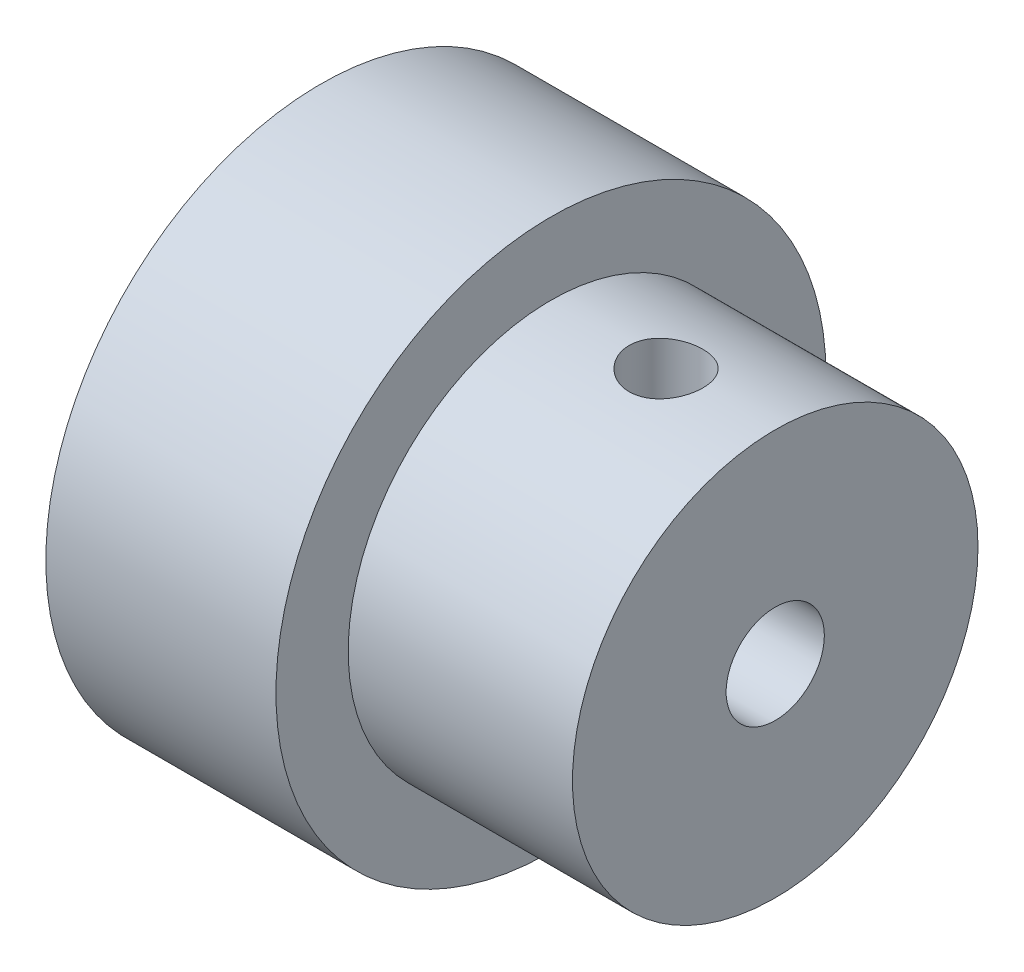
ISO-10303-21;
HEADER;
FILE_DESCRIPTION(('STEP AP214'),'2;1');
FILE_NAME('part.step','',(''),(''),'','','');
FILE_SCHEMA(('AUTOMOTIVE_DESIGN { 1 0 10303 214 1 1 1 1 }'));
ENDSEC;
DATA;
#1=APPLICATION_CONTEXT('core data for automotive mechanical design processes');
#2=APPLICATION_PROTOCOL_DEFINITION('international standard','automotive_design',2000,#1);
#3=PRODUCT_CONTEXT('',#1,'mechanical');
#4=PRODUCT('Part','Part','',(#3));
#5=PRODUCT_RELATED_PRODUCT_CATEGORY('part','',(#4));
#6=PRODUCT_DEFINITION_FORMATION('','',#4);
#7=PRODUCT_DEFINITION_CONTEXT('part definition',#1,'design');
#8=PRODUCT_DEFINITION('design','',#6,#7);
#9=PRODUCT_DEFINITION_SHAPE('','',#8);
#10=(LENGTH_UNIT() NAMED_UNIT(*) SI_UNIT(.MILLI.,.METRE.));
#11=(NAMED_UNIT(*) PLANE_ANGLE_UNIT() SI_UNIT($,.RADIAN.));
#12=(NAMED_UNIT(*) SI_UNIT($,.STERADIAN.) SOLID_ANGLE_UNIT());
#13=UNCERTAINTY_MEASURE_WITH_UNIT(LENGTH_MEASURE(1.E-05),#10,'distance_accuracy_value','');
#14=(GEOMETRIC_REPRESENTATION_CONTEXT(3) GLOBAL_UNCERTAINTY_ASSIGNED_CONTEXT((#13)) GLOBAL_UNIT_ASSIGNED_CONTEXT((#10,
#11,#12)) REPRESENTATION_CONTEXT('',''));
#15=CARTESIAN_POINT('',(0.,0.,0.));
#16=DIRECTION('',(0.,0.,1.));
#17=DIRECTION('',(1.,0.,0.));
#18=AXIS2_PLACEMENT_3D('',#15,#16,#17);
#19=CARTESIAN_POINT('',(-14.6892880689265,0.,0.));
#20=DIRECTION('',(1.,0.,0.));
#21=DIRECTION('',(0.,0.,-1.));
#22=AXIS2_PLACEMENT_3D('',#19,#20,#21);
#23=PLANE('',#22);
#24=CARTESIAN_POINT('',(-14.6892880689265,0.,0.));
#25=DIRECTION('',(1.,0.,0.));
#26=DIRECTION('',(0.,0.,-1.));
#27=AXIS2_PLACEMENT_3D('',#24,#25,#26);
#28=CIRCLE('',#27,8.89);
#29=CARTESIAN_POINT('',(-14.6892880689265,0.,-8.89));
#30=VERTEX_POINT('',#29);
#31=EDGE_CURVE('E122',#30,#30,#28,.T.);
#32=ORIENTED_EDGE('',*,*,#31,.F.);
#33=EDGE_LOOP('',(#32));
#34=FACE_BOUND('',#33,.T.);
#35=CARTESIAN_POINT('',(-14.6892880689265,0.,0.));
#36=DIRECTION('',(1.,0.,0.));
#37=DIRECTION('',(0.,0.,-1.));
#38=AXIS2_PLACEMENT_3D('',#35,#36,#37);
#39=CIRCLE('',#38,1.5875);
#40=CARTESIAN_POINT('',(-14.6892880689265,0.,-1.5875));
#41=VERTEX_POINT('',#40);
#42=EDGE_CURVE('E10',#41,#41,#39,.T.);
#43=ORIENTED_EDGE('',*,*,#42,.T.);
#44=EDGE_LOOP('',(#43));
#45=FACE_BOUND('',#44,.T.);
#46=ADVANCED_FACE('F45',(#34,#45),#23,.F.);
#47=CARTESIAN_POINT('',(0.,0.,0.));
#48=DIRECTION('',(1.,0.,0.));
#49=DIRECTION('',(0.,0.,-1.));
#50=AXIS2_PLACEMENT_3D('',#47,#48,#49);
#51=CYLINDRICAL_SURFACE('',#50,1.5875);
#52=CARTESIAN_POINT('',(-3.52955632665525,-1.05003255157876,1.190625));
#53=CARTESIAN_POINT('',(-3.47399587181116,-1.050045445975,1.19061880120499));
#54=CARTESIAN_POINT('',(-3.41839494567017,-1.05454741000987,1.18668886577821));
#55=CARTESIAN_POINT('',(-3.30942575328898,-1.07148823701036,1.17140301985762));
#56=CARTESIAN_POINT('',(-3.25606464842102,-1.08395075602632,1.16002497361435));
#57=CARTESIAN_POINT('',(-3.15365232330667,-1.11422757784016,1.13096547199778));
#58=CARTESIAN_POINT('',(-3.10455179760005,-1.13196567044321,1.11337314984434));
#59=CARTESIAN_POINT('',(-3.01016962218938,-1.17067373681068,1.0725995764387));
#60=CARTESIAN_POINT('',(-2.96488751182031,-1.19164331985289,1.04941900067592));
#61=CARTESIAN_POINT('',(-2.86906679457896,-1.2396574216291,0.992504284125244));
#62=CARTESIAN_POINT('',(-2.81941365386299,-1.26705442557768,0.957576618231006));
#63=CARTESIAN_POINT('',(-2.72586423782545,-1.321761740015,0.880535424277007));
#64=CARTESIAN_POINT('',(-2.68197661082916,-1.34907186163527,0.83841131436972));
#65=CARTESIAN_POINT('',(-2.59224970284748,-1.40702174808774,0.737878090100433));
#66=CARTESIAN_POINT('',(-2.54784159057137,-1.43720281226121,0.677900035756593));
#67=CARTESIAN_POINT('',(-2.47019994883075,-1.49131980240358,0.548631836139916));
#68=CARTESIAN_POINT('',(-2.43694016553939,-1.51527037067959,0.479364114482458));
#69=CARTESIAN_POINT('',(-2.39194772596979,-1.54808443073509,0.355496037787019));
#70=CARTESIAN_POINT('',(-2.37674788172235,-1.55931958043549,0.302772801943451));
#71=CARTESIAN_POINT('',(-2.35370292208284,-1.57643223525434,0.194907383645006));
#72=CARTESIAN_POINT('',(-2.34585141687053,-1.58231439499439,0.139767346508667));
#73=CARTESIAN_POINT('',(-2.3379615754019,-1.58822529365106,0.0284679172687354));
#74=CARTESIAN_POINT('',(-2.33794354099396,-1.58823882295637,-0.0276937463004187));
#75=CARTESIAN_POINT('',(-2.34577181397461,-1.58237401411808,-0.139157199360015));
#76=CARTESIAN_POINT('',(-2.35361994258859,-1.57649431153499,-0.194458786708892));
#77=CARTESIAN_POINT('',(-2.37630191056096,-1.55965031243376,-0.300743297572916));
#78=CARTESIAN_POINT('',(-2.390887285725,-1.54886705851508,-0.351809262912558));
#79=CARTESIAN_POINT('',(-2.4262403676374,-1.52306558684007,-0.450596385005576));
#80=CARTESIAN_POINT('',(-2.44700942243758,-1.50804644569141,-0.498316809620447));
#81=CARTESIAN_POINT('',(-2.49651420867685,-1.472890802502,-0.594690931730129));
#82=CARTESIAN_POINT('',(-2.52586905334639,-1.45237629107677,-0.642886211616418));
#83=CARTESIAN_POINT('',(-2.59033870418185,-1.40859432596468,-0.733875255122699));
#84=CARTESIAN_POINT('',(-2.62545841877955,-1.38532453106985,-0.776664360293093));
#85=CARTESIAN_POINT('',(-2.70820235978188,-1.33265676661185,-0.864458871498921));
#86=CARTESIAN_POINT('',(-2.75692738711371,-1.30295376843929,-0.908244413225473));
#87=CARTESIAN_POINT('',(-2.86108752740517,-1.24401229387742,-0.987431949727556));
#88=CARTESIAN_POINT('',(-2.91652581815327,-1.21477404494797,-1.0228299505536));
#89=CARTESIAN_POINT('',(-3.02233568616272,-1.16537919386833,-1.07849357589208));
#90=CARTESIAN_POINT('',(-3.07155229386264,-1.14456844833299,-1.10036663076556));
#91=CARTESIAN_POINT('',(-3.17400814378189,-1.10757288373056,-1.13759771455097));
#92=CARTESIAN_POINT('',(-3.22723796990948,-1.09137763785656,-1.15297046685305));
#93=CARTESIAN_POINT('',(-3.32610783845392,-1.06870540179809,-1.17397518372094));
#94=CARTESIAN_POINT('',(-3.37116119808551,-1.06093847023265,-1.18093386412912));
#95=CARTESIAN_POINT('',(-3.46236972793073,-1.05120748322927,-1.18960709991958));
#96=CARTESIAN_POINT('',(-3.50852341207812,-1.04923600365031,-1.19132836468154));
#97=CARTESIAN_POINT('',(-3.60058027634364,-1.05142402102457,-1.18939683154219));
#98=CARTESIAN_POINT('',(-3.64648335801668,-1.05558577464436,-1.1857420555772));
#99=CARTESIAN_POINT('',(-3.73678552265678,-1.06934967402693,-1.17334131022126));
#100=CARTESIAN_POINT('',(-3.78118190127656,-1.0789611050858,-1.16458665082263));
#101=CARTESIAN_POINT('',(-3.88383714982548,-1.10670783140942,-1.13834830402645));
#102=CARTESIAN_POINT('',(-3.94106486507531,-1.12668703809744,-1.11882388129336));
#103=CARTESIAN_POINT('',(-4.05050053466959,-1.1710817723223,-1.07226796784258));
#104=CARTESIAN_POINT('',(-4.10269900600796,-1.19550543916301,-1.04522265503785));
#105=CARTESIAN_POINT('',(-4.20372710179345,-1.24704699135672,-0.983216332051275));
#106=CARTESIAN_POINT('',(-4.25237117215349,-1.27422976552798,-0.948008248603961));
#107=CARTESIAN_POINT('',(-4.34394549064199,-1.32832083103686,-0.870605343134578));
#108=CARTESIAN_POINT('',(-4.38687294449647,-1.3552289822489,-0.828407126793555));
#109=CARTESIAN_POINT('',(-4.47513243876106,-1.41255926707429,-0.727261145352264));
#110=CARTESIAN_POINT('',(-4.51894604749847,-1.44246738243752,-0.666667665064069));
#111=CARTESIAN_POINT('',(-4.59526153383188,-1.49584651911049,-0.536219092541945));
#112=CARTESIAN_POINT('',(-4.62778789366665,-1.519331448665,-0.46638450504254));
#113=CARTESIAN_POINT('',(-4.6713164823662,-1.55114153831888,-0.341912306313174));
#114=CARTESIAN_POINT('',(-4.68585703131764,-1.56190535686026,-0.289123483003683));
#115=CARTESIAN_POINT('',(-4.70758355872435,-1.57805648311366,-0.181264294065456));
#116=CARTESIAN_POINT('',(-4.71477611263438,-1.58344859766149,-0.126196014246044));
#117=CARTESIAN_POINT('',(-4.72138496195483,-1.58840143581668,-0.0151984122151932));
#118=CARTESIAN_POINT('',(-4.72078300292542,-1.58794847048757,0.040732624740999));
#119=CARTESIAN_POINT('',(-4.7117985398099,-1.58121987574774,0.151613402505125));
#120=CARTESIAN_POINT('',(-4.70341396297494,-1.57494269517078,0.206562877919334));
#121=CARTESIAN_POINT('',(-4.67971998694751,-1.55736449484373,0.312358036108632));
#122=CARTESIAN_POINT('',(-4.66461868273127,-1.54621460816847,0.363276543980955));
#123=CARTESIAN_POINT('',(-4.62827454957022,-1.51973534456514,0.461693691083551));
#124=CARTESIAN_POINT('',(-4.60703040691447,-1.50440507365769,0.50919159606487));
#125=CARTESIAN_POINT('',(-4.55644821368846,-1.46857753504696,0.605272235896156));
#126=CARTESIAN_POINT('',(-4.52646589988858,-1.44769167461642,0.653368356641274));
#127=CARTESIAN_POINT('',(-4.46073108946535,-1.403234954476,0.744073006806094));
#128=CARTESIAN_POINT('',(-4.42497328955946,-1.37966163294053,0.786676427329301));
#129=CARTESIAN_POINT('',(-4.34076456694763,-1.32640667727172,0.874017021494155));
#130=CARTESIAN_POINT('',(-4.29120199709983,-1.29643919738103,0.917509051614588));
#131=CARTESIAN_POINT('',(-4.18529854458473,-1.2371870295527,0.995959824095465));
#132=CARTESIAN_POINT('',(-4.12895518973873,-1.20790259531751,1.03091544004403));
#133=CARTESIAN_POINT('',(-4.0225677464992,-1.15926871150369,1.0850242722053));
#134=CARTESIAN_POINT('',(-3.97379043413193,-1.13913939849811,1.10595986530786));
#135=CARTESIAN_POINT('',(-3.87239051441715,-1.10357098191916,1.14145534685201));
#136=CARTESIAN_POINT('',(-3.81977855895137,-1.08811945745383,1.15603216594685));
#137=CARTESIAN_POINT('',(-3.72736817735019,-1.06785111060464,1.17472664594127));
#138=CARTESIAN_POINT('',(-3.68833246381845,-1.06124478398383,1.18065747665075));
#139=CARTESIAN_POINT('',(-3.60938984980979,-1.05233228217761,1.18860759763756));
#140=CARTESIAN_POINT('',(-3.56948353840617,-1.05002328532471,1.19062945461798));
#141=CARTESIAN_POINT('',(-3.52955632665525,-1.05003255157876,1.190625));
#142=B_SPLINE_CURVE_WITH_KNOTS('',3,(#52,#53,#54,#55,#56,#57,#58,#59,#60,#61,#62,#63,#64,#65,
#66,#67,#68,#69,#70,#71,#72,#73,#74,#75,#76,#77,#78,#79,#80,#81,#82,#83,#84,#85,#86,#87,#88,#89,
#90,#91,#92,#93,#94,#95,#96,#97,#98,#99,#100,#101,#102,#103,#104,#105,#106,#107,#108,#109,#110,
#111,#112,#113,#114,#115,#116,#117,#118,#119,#120,#121,#122,#123,#124,#125,#126,#127,#128,#129,
#130,#131,#132,#133,#134,#135,#136,#137,#138,#139,#140,#141),.UNSPECIFIED.,.T.,.F.,(4,2,2,2,2,2,
2,2,2,2,2,2,2,2,2,2,2,2,2,2,2,2,2,2,2,2,2,2,2,2,2,2,2,2,2,2,2,2,2,2,2,2,2,2,4),(0.,
0.166474597743314,0.333446217300251,0.498114149835984,0.662762187833673,0.861895093986152,
1.0613233713153,1.30147098182183,1.54104901534439,1.70837006939059,1.87554549222377,
2.04315417765196,2.21080167790273,2.37270731241696,2.53464826848756,2.71412370017785,
2.89375274442082,3.10871804281232,3.32378549783047,3.49646406272525,3.66874938249073,
3.80688854402059,3.9448506680219,4.08286356658931,4.22111232464965,4.41110709885653,
4.60145338469826,4.79856172215235,4.99576605498253,5.23599171487223,5.47569301565586,
5.64239486354326,5.80894740496725,5.97589007623953,6.14287722220568,6.30501670074205,
6.46719088019845,6.64773604163628,6.82844793934811,7.0449089208391,7.26144906140521,
7.43123259464913,7.6005612670708,7.72027294583552,7.83990599300725),.UNSPECIFIED.);
#143=CARTESIAN_POINT('',(-3.52955632665525,-1.05003255157876,1.190625));
#144=VERTEX_POINT('',#143);
#145=EDGE_CURVE('E95',#144,#144,#142,.T.);
#146=ORIENTED_EDGE('',*,*,#145,.F.);
#147=EDGE_LOOP('',(#146));
#148=FACE_BOUND('',#147,.T.);
#149=CARTESIAN_POINT('',(-3.52955632665525,1.05003255157876,1.190625));
#150=CARTESIAN_POINT('',(-3.58511678149935,1.050045445975,1.19061880120499));
#151=CARTESIAN_POINT('',(-3.64071770764034,1.05454741000987,1.18668886577821));
#152=CARTESIAN_POINT('',(-3.74968690002153,1.07148823701036,1.17140301985762));
#153=CARTESIAN_POINT('',(-3.80304800488949,1.08395075602632,1.16002497361435));
#154=CARTESIAN_POINT('',(-3.90546033000384,1.11422757784016,1.13096547199778));
#155=CARTESIAN_POINT('',(-3.95456085571046,1.13196567044321,1.11337314984434));
#156=CARTESIAN_POINT('',(-4.04894303112113,1.17067373681068,1.0725995764387));
#157=CARTESIAN_POINT('',(-4.0942251414902,1.19164331985289,1.04941900067592));
#158=CARTESIAN_POINT('',(-4.19004585873155,1.2396574216291,0.992504284125244));
#159=CARTESIAN_POINT('',(-4.23969899944752,1.26705442557768,0.957576618231007));
#160=CARTESIAN_POINT('',(-4.33324841548505,1.321761740015,0.880535424277007));
#161=CARTESIAN_POINT('',(-4.37713604248134,1.34907186163527,0.83841131436972));
#162=CARTESIAN_POINT('',(-4.46686295046303,1.40702174808774,0.737878090100434));
#163=CARTESIAN_POINT('',(-4.51127106273914,1.43720281226121,0.677900035756593));
#164=CARTESIAN_POINT('',(-4.58891270447975,1.49131980240358,0.548631836139916));
#165=CARTESIAN_POINT('',(-4.62217248777112,1.51527037067959,0.479364114482458));
#166=CARTESIAN_POINT('',(-4.66716492734071,1.54808443073509,0.355496037787019));
#167=CARTESIAN_POINT('',(-4.68236477158816,1.55931958043549,0.302772801943451));
#168=CARTESIAN_POINT('',(-4.70540973122767,1.57643223525434,0.194907383645006));
#169=CARTESIAN_POINT('',(-4.71326123643998,1.58231439499439,0.139767346508666));
#170=CARTESIAN_POINT('',(-4.72115107790861,1.58822529365106,0.0284679172687352));
#171=CARTESIAN_POINT('',(-4.72116911231655,1.58823882295637,-0.0276937463004189));
#172=CARTESIAN_POINT('',(-4.7133408393359,1.58237401411808,-0.139157199360016));
#173=CARTESIAN_POINT('',(-4.70549271072191,1.57649431153499,-0.194458786708892));
#174=CARTESIAN_POINT('',(-4.68281074274955,1.55965031243376,-0.300743297572916));
#175=CARTESIAN_POINT('',(-4.66822536758551,1.54886705851508,-0.351809262912558));
#176=CARTESIAN_POINT('',(-4.63287228567311,1.52306558684007,-0.450596385005576));
#177=CARTESIAN_POINT('',(-4.61210323087293,1.50804644569141,-0.498316809620447));
#178=CARTESIAN_POINT('',(-4.56259844463366,1.472890802502,-0.594690931730128));
#179=CARTESIAN_POINT('',(-4.53324359996412,1.45237629107677,-0.642886211616417));
#180=CARTESIAN_POINT('',(-4.46877394912866,1.40859432596468,-0.733875255122699));
#181=CARTESIAN_POINT('',(-4.43365423453096,1.38532453106985,-0.776664360293093));
#182=CARTESIAN_POINT('',(-4.35091029352863,1.33265676661185,-0.86445887149892));
#183=CARTESIAN_POINT('',(-4.3021852661968,1.30295376843929,-0.908244413225473));
#184=CARTESIAN_POINT('',(-4.19802512590534,1.24401229387742,-0.987431949727557));
#185=CARTESIAN_POINT('',(-4.14258683515724,1.21477404494797,-1.0228299505536));
#186=CARTESIAN_POINT('',(-4.03677696714779,1.16537919386833,-1.07849357589208));
#187=CARTESIAN_POINT('',(-3.98756035944787,1.14456844833299,-1.10036663076556));
#188=CARTESIAN_POINT('',(-3.88510450952862,1.10757288373056,-1.13759771455097));
#189=CARTESIAN_POINT('',(-3.83187468340103,1.09137763785656,-1.15297046685305));
#190=CARTESIAN_POINT('',(-3.73300481485659,1.06870540179809,-1.17397518372094));
#191=CARTESIAN_POINT('',(-3.687951455225,1.06093847023265,-1.18093386412912));
#192=CARTESIAN_POINT('',(-3.59674292537978,1.05120748322927,-1.18960709991958));
#193=CARTESIAN_POINT('',(-3.55058924123239,1.04923600365031,-1.19132836468154));
#194=CARTESIAN_POINT('',(-3.45853237696687,1.05142402102457,-1.18939683154219));
#195=CARTESIAN_POINT('',(-3.41262929529383,1.05558577464436,-1.1857420555772));
#196=CARTESIAN_POINT('',(-3.32232713065373,1.06934967402693,-1.17334131022126));
#197=CARTESIAN_POINT('',(-3.27793075203395,1.0789611050858,-1.16458665082263));
#198=CARTESIAN_POINT('',(-3.17527550348503,1.10670783140942,-1.13834830402645));
#199=CARTESIAN_POINT('',(-3.1180477882352,1.12668703809744,-1.11882388129336));
#200=CARTESIAN_POINT('',(-3.00861211864092,1.1710817723223,-1.07226796784258));
#201=CARTESIAN_POINT('',(-2.95641364730255,1.19550543916301,-1.04522265503785));
#202=CARTESIAN_POINT('',(-2.85538555151706,1.24704699135672,-0.983216332051275));
#203=CARTESIAN_POINT('',(-2.80674148115702,1.27422976552798,-0.948008248603961));
#204=CARTESIAN_POINT('',(-2.71516716266852,1.32832083103686,-0.870605343134578));
#205=CARTESIAN_POINT('',(-2.67223970881404,1.3552289822489,-0.828407126793555));
#206=CARTESIAN_POINT('',(-2.58398021454945,1.41255926707429,-0.727261145352264));
#207=CARTESIAN_POINT('',(-2.54016660581204,1.44246738243751,-0.66666766506407));
#208=CARTESIAN_POINT('',(-2.46385111947863,1.49584651911049,-0.536219092541946));
#209=CARTESIAN_POINT('',(-2.43132475964385,1.519331448665,-0.466384505042541));
#210=CARTESIAN_POINT('',(-2.3877961709443,1.55114153831888,-0.341912306313175));
#211=CARTESIAN_POINT('',(-2.37325562199287,1.56190535686026,-0.289123483003684));
#212=CARTESIAN_POINT('',(-2.35152909458616,1.57805648311366,-0.181264294065457));
#213=CARTESIAN_POINT('',(-2.34433654067613,1.58344859766149,-0.126196014246045));
#214=CARTESIAN_POINT('',(-2.33772769135568,1.58840143581668,-0.0151984122151944));
#215=CARTESIAN_POINT('',(-2.33832965038508,1.58794847048757,0.0407326247409978));
#216=CARTESIAN_POINT('',(-2.34731411350061,1.58121987574774,0.151613402505124));
#217=CARTESIAN_POINT('',(-2.35569869033556,1.57494269517078,0.206562877919333));
#218=CARTESIAN_POINT('',(-2.379392666363,1.55736449484374,0.312358036108631));
#219=CARTESIAN_POINT('',(-2.39449397057923,1.54621460816847,0.363276543980954));
#220=CARTESIAN_POINT('',(-2.43083810374029,1.51973534456514,0.46169369108355));
#221=CARTESIAN_POINT('',(-2.45208224639604,1.50440507365769,0.509191596064869));
#222=CARTESIAN_POINT('',(-2.50266443962205,1.46857753504696,0.605272235896155));
#223=CARTESIAN_POINT('',(-2.53264675342192,1.44769167461642,0.653368356641273));
#224=CARTESIAN_POINT('',(-2.59838156384516,1.403234954476,0.744073006806093));
#225=CARTESIAN_POINT('',(-2.63413936375105,1.37966163294053,0.7866764273293));
#226=CARTESIAN_POINT('',(-2.71834808636288,1.32640667727172,0.874017021494154));
#227=CARTESIAN_POINT('',(-2.76791065621068,1.29643919738103,0.917509051614587));
#228=CARTESIAN_POINT('',(-2.87381410872578,1.2371870295527,0.995959824095464));
#229=CARTESIAN_POINT('',(-2.93015746357177,1.20790259531751,1.03091544004403));
#230=CARTESIAN_POINT('',(-3.03654490681131,1.15926871150369,1.0850242722053));
#231=CARTESIAN_POINT('',(-3.08532221917858,1.13913939849812,1.10595986530786));
#232=CARTESIAN_POINT('',(-3.18672213889336,1.10357098191916,1.14145534685201));
#233=CARTESIAN_POINT('',(-3.23933409435914,1.08811945745383,1.15603216594685));
#234=CARTESIAN_POINT('',(-3.33174447596032,1.06785111060464,1.17472664594127));
#235=CARTESIAN_POINT('',(-3.37078018949206,1.06124478398383,1.18065747665075));
#236=CARTESIAN_POINT('',(-3.44972280350072,1.05233228217761,1.18860759763756));
#237=CARTESIAN_POINT('',(-3.48962911490434,1.05002328532471,1.19062945461798));
#238=CARTESIAN_POINT('',(-3.52955632665525,1.05003255157876,1.190625));
#239=B_SPLINE_CURVE_WITH_KNOTS('',3,(#149,#150,#151,#152,#153,#154,#155,#156,#157,#158,#159,
#160,#161,#162,#163,#164,#165,#166,#167,#168,#169,#170,#171,#172,#173,#174,#175,#176,#177,#178,
#179,#180,#181,#182,#183,#184,#185,#186,#187,#188,#189,#190,#191,#192,#193,#194,#195,#196,#197,
#198,#199,#200,#201,#202,#203,#204,#205,#206,#207,#208,#209,#210,#211,#212,#213,#214,#215,#216,
#217,#218,#219,#220,#221,#222,#223,#224,#225,#226,#227,#228,#229,#230,#231,#232,#233,#234,#235,
#236,#237,#238),.UNSPECIFIED.,.T.,.F.,(4,2,2,2,2,2,2,2,2,2,2,2,2,2,2,2,2,2,2,2,2,2,2,2,2,2,2,2,
2,2,2,2,2,2,2,2,2,2,2,2,2,2,2,2,4),(0.,0.166474597743314,0.333446217300251,0.498114149835984,
0.662762187833672,0.861895093986151,1.0613233713153,1.30147098182183,1.5410490153444,
1.70837006939059,1.87554549222377,2.04315417765196,2.21080167790273,2.37270731241696,
2.53464826848756,2.71412370017785,2.89375274442082,3.10871804281232,3.32378549783047,
3.49646406272525,3.66874938249073,3.80688854402059,3.9448506680219,4.08286356658931,
4.22111232464965,4.41110709885653,4.60145338469826,4.79856172215235,4.99576605498252,
5.23599171487223,5.47569301565586,5.64239486354326,5.80894740496724,5.97589007623953,
6.14287722220568,6.30501670074205,6.46719088019845,6.64773604163628,6.82844793934811,
7.0449089208391,7.26144906140521,7.43123259464912,7.60056126707079,7.72027294583552,
7.83990599300725),.UNSPECIFIED.);
#240=CARTESIAN_POINT('',(-3.52955632665525,1.05003255157876,1.190625));
#241=VERTEX_POINT('',#240);
#242=EDGE_CURVE('E89',#241,#241,#239,.T.);
#243=ORIENTED_EDGE('',*,*,#242,.F.);
#244=EDGE_LOOP('',(#243));
#245=FACE_BOUND('',#244,.T.);
#246=CARTESIAN_POINT('',(0.,0.,0.));
#247=DIRECTION('',(1.,0.,0.));
#248=DIRECTION('',(0.,0.,-1.));
#249=AXIS2_PLACEMENT_3D('',#246,#247,#248);
#250=CIRCLE('',#249,1.5875);
#251=CARTESIAN_POINT('',(0.,0.,-1.5875));
#252=VERTEX_POINT('',#251);
#253=EDGE_CURVE('E58',#252,#252,#250,.T.);
#254=ORIENTED_EDGE('',*,*,#253,.T.);
#255=EDGE_LOOP('',(#254));
#256=FACE_BOUND('',#255,.T.);
#257=ORIENTED_EDGE('',*,*,#42,.F.);
#258=EDGE_LOOP('',(#257));
#259=FACE_BOUND('',#258,.T.);
#260=ADVANCED_FACE('F100',(#148,#245,#256,#259),#51,.F.);
#261=CARTESIAN_POINT('',(0.,0.,0.));
#262=DIRECTION('',(1.,0.,0.));
#263=DIRECTION('',(0.,0.,-1.));
#264=AXIS2_PLACEMENT_3D('',#261,#262,#263);
#265=PLANE('',#264);
#266=CARTESIAN_POINT('',(0.,0.,0.));
#267=DIRECTION('',(1.,0.,0.));
#268=DIRECTION('',(0.,0.,-1.));
#269=AXIS2_PLACEMENT_3D('',#266,#267,#268);
#270=CIRCLE('',#269,6.554286829);
#271=CARTESIAN_POINT('',(0.,0.,-6.554286829));
#272=VERTEX_POINT('',#271);
#273=EDGE_CURVE('E64',#272,#272,#270,.T.);
#274=ORIENTED_EDGE('',*,*,#273,.T.);
#275=EDGE_LOOP('',(#274));
#276=FACE_BOUND('',#275,.T.);
#277=ORIENTED_EDGE('',*,*,#253,.F.);
#278=EDGE_LOOP('',(#277));
#279=FACE_BOUND('',#278,.T.);
#280=ADVANCED_FACE('F103',(#276,#279),#265,.T.);
#281=CARTESIAN_POINT('',(0.,0.,0.));
#282=DIRECTION('',(1.,0.,0.));
#283=DIRECTION('',(0.,0.,-1.));
#284=AXIS2_PLACEMENT_3D('',#281,#282,#283);
#285=CYLINDRICAL_SURFACE('',#284,6.554286829);
#286=CARTESIAN_POINT('',(-3.52955632665525,-6.44523761751092,1.190625));
#287=CARTESIAN_POINT('',(-3.59583956128514,-6.44523887950883,1.1906224197523));
#288=CARTESIAN_POINT('',(-3.6621567229071,-6.44627120699053,1.18507115351719));
#289=CARTESIAN_POINT('',(-3.79292376494953,-6.45028423763767,1.16302617132106));
#290=CARTESIAN_POINT('',(-3.85737197017392,-6.45326663556609,1.14652293706106));
#291=CARTESIAN_POINT('',(-3.98248997868691,-6.46083113577569,1.10309527617529));
#292=CARTESIAN_POINT('',(-4.04316313836135,-6.46541179238911,1.07618026489723));
#293=CARTESIAN_POINT('',(-4.15912810401802,-6.47565497479881,1.01271759661221));
#294=CARTESIAN_POINT('',(-4.21442038319229,-6.48131740533441,0.976170787670907));
#295=CARTESIAN_POINT('',(-4.3187051514293,-6.49316005521002,0.89402654406117));
#296=CARTESIAN_POINT('',(-4.36762561549446,-6.49934507534603,0.848338350074221));
#297=CARTESIAN_POINT('',(-4.45715110972728,-6.51149353718199,0.749404416364047));
#298=CARTESIAN_POINT('',(-4.49775560988805,-6.51745696473921,0.696158195305966));
#299=CARTESIAN_POINT('',(-4.56977094893948,-6.52854158173729,0.583148399520847));
#300=CARTESIAN_POINT('',(-4.60111412803868,-6.53365645860926,0.523341036552394));
#301=CARTESIAN_POINT('',(-4.65328149717483,-6.54241401814463,0.399201231268084));
#302=CARTESIAN_POINT('',(-4.67410649895182,-6.54605681441147,0.334869138584805));
#303=CARTESIAN_POINT('',(-4.70442433899459,-6.55142586405278,0.204251803401231));
#304=CARTESIAN_POINT('',(-4.71403848893985,-6.55317261975116,0.137995575413837));
#305=CARTESIAN_POINT('',(-4.72203948185344,-6.55462337749469,0.00478902493600215));
#306=CARTESIAN_POINT('',(-4.72042722461506,-6.55432754325286,-0.0621612414979873));
#307=CARTESIAN_POINT('',(-4.70611466477305,-6.55174253606673,-0.19402418549043));
#308=CARTESIAN_POINT('',(-4.69354496440991,-6.54947684279621,-0.258951565361035));
#309=CARTESIAN_POINT('',(-4.65788061936053,-6.54323297437036,-0.385759991369599));
#310=CARTESIAN_POINT('',(-4.6347856087817,-6.53925473968203,-0.447640931520951));
#311=CARTESIAN_POINT('',(-4.57860023179956,-6.52999331694189,-0.566981522398128));
#312=CARTESIAN_POINT('',(-4.54545718997045,-6.52470327921714,-0.624415820346531));
#313=CARTESIAN_POINT('',(-4.47015530526871,-6.51340407645875,-0.732956616091992));
#314=CARTESIAN_POINT('',(-4.42799559983111,-6.5073948426486,-0.784062507752928));
#315=CARTESIAN_POINT('',(-4.33513606775894,-6.49522152079942,-0.879268984233313));
#316=CARTESIAN_POINT('',(-4.28432200912281,-6.48905644892552,-0.923258099374822));
#317=CARTESIAN_POINT('',(-4.17597798644627,-6.47734928881718,-1.00210565700849));
#318=CARTESIAN_POINT('',(-4.11844793569179,-6.47180720862837,-1.03696398158884));
#319=CARTESIAN_POINT('',(-3.99816263152389,-6.46197234841474,-1.09658932991552));
#320=CARTESIAN_POINT('',(-3.93539958580965,-6.4576814758463,-1.12134096885283));
#321=CARTESIAN_POINT('',(-3.80651054687131,-6.4508646929319,-1.15991727275392));
#322=CARTESIAN_POINT('',(-3.74038491037086,-6.44833859578537,-1.17374309423025));
#323=CARTESIAN_POINT('',(-3.60765064490174,-6.44537410909697,-1.18991424556761));
#324=CARTESIAN_POINT('',(-3.54106211186,-6.44490666565852,-1.19241935852966));
#325=CARTESIAN_POINT('',(-3.408417968189,-6.44603477003537,-1.18630556491426));
#326=CARTESIAN_POINT('',(-3.34236233304817,-6.44763022241343,-1.17768717295164));
#327=CARTESIAN_POINT('',(-3.21317915946544,-6.4526773518251,-1.14970791527429));
#328=CARTESIAN_POINT('',(-3.15003302215193,-6.45611467186332,-1.13043010106681));
#329=CARTESIAN_POINT('',(-3.027867205375,-6.46444596337797,-1.08176704730256));
#330=CARTESIAN_POINT('',(-2.96884781398609,-6.4693400364204,-1.05238110297645));
#331=CARTESIAN_POINT('',(-2.85590480587881,-6.4800999518119,-0.98396547396782));
#332=CARTESIAN_POINT('',(-2.80204355911806,-6.48597577974908,-0.944834426443363));
#333=CARTESIAN_POINT('',(-2.70159418559958,-6.49800873876684,-0.858176769127755));
#334=CARTESIAN_POINT('',(-2.65500667154226,-6.50416589348847,-0.810649452797735));
#335=CARTESIAN_POINT('',(-2.56983420713818,-6.51616068999166,-0.707836401336362));
#336=CARTESIAN_POINT('',(-2.53135645703738,-6.52199338154321,-0.652461191750872));
#337=CARTESIAN_POINT('',(-2.46425066498607,-6.53259994280098,-0.535939618115183));
#338=CARTESIAN_POINT('',(-2.43562226054241,-6.53737385147212,-0.474793466563027));
#339=CARTESIAN_POINT('',(-2.38919015463837,-6.54530360219113,-0.348768386974086));
#340=CARTESIAN_POINT('',(-2.37133280549819,-6.54846745096786,-0.283909750394655));
#341=CARTESIAN_POINT('',(-2.34677802075708,-6.55285467085529,-0.152051266689976));
#342=CARTESIAN_POINT('',(-2.34007948608173,-6.55407823307168,-0.0850516311025111));
#343=CARTESIAN_POINT('',(-2.33806881130686,-6.55444353830863,0.0481570269174936));
#344=CARTESIAN_POINT('',(-2.3425944195661,-6.55361494667234,0.114363573988938));
#345=CARTESIAN_POINT('',(-2.36254949673581,-6.55003037055457,0.245056441714693));
#346=CARTESIAN_POINT('',(-2.3779788746158,-6.54727440216385,0.309542776725587));
#347=CARTESIAN_POINT('',(-2.41923687354477,-6.54014434195498,0.434885837506977));
#348=CARTESIAN_POINT('',(-2.44504922909142,-6.53577278191571,0.495748070218711));
#349=CARTESIAN_POINT('',(-2.50632144860015,-6.52588591912051,0.61230216637306));
#350=CARTESIAN_POINT('',(-2.54178190517392,-6.52037054611353,0.667993711936569));
#351=CARTESIAN_POINT('',(-2.62190714761972,-6.50871162569933,0.773436731878535));
#352=CARTESIAN_POINT('',(-2.66668963779485,-6.50256060843079,0.823097948066691));
#353=CARTESIAN_POINT('',(-2.76394255751042,-6.49037210090815,0.914257214389549));
#354=CARTESIAN_POINT('',(-2.81641478912277,-6.48433463764039,0.955753345702143));
#355=CARTESIAN_POINT('',(-2.92809651682693,-6.47300028583857,1.02973782878996));
#356=CARTESIAN_POINT('',(-2.98736006271804,-6.46771021135558,1.0621456609834));
#357=CARTESIAN_POINT('',(-3.11056589946905,-6.45855110615477,1.11649421755382));
#358=CARTESIAN_POINT('',(-3.1745036297226,-6.45468071187303,1.13844499173583));
#359=CARTESIAN_POINT('',(-3.28713313721014,-6.44962134111189,1.16670507506335));
#360=CARTESIAN_POINT('',(-3.33515851945384,-6.44798702253015,1.175659965834));
#361=CARTESIAN_POINT('',(-3.43196859164261,-6.44579470923299,1.18762080581468));
#362=CARTESIAN_POINT('',(-3.48075326308155,-6.44523668832628,1.19062689978647));
#363=CARTESIAN_POINT('',(-3.52955632665525,-6.44523761751092,1.190625));
#364=B_SPLINE_CURVE_WITH_KNOTS('',3,(#286,#287,#288,#289,#290,#291,#292,#293,#294,#295,#296,
#297,#298,#299,#300,#301,#302,#303,#304,#305,#306,#307,#308,#309,#310,#311,#312,#313,#314,#315,
#316,#317,#318,#319,#320,#321,#322,#323,#324,#325,#326,#327,#328,#329,#330,#331,#332,#333,#334,
#335,#336,#337,#338,#339,#340,#341,#342,#343,#344,#345,#346,#347,#348,#349,#350,#351,#352,#353,
#354,#355,#356,#357,#358,#359,#360,#361,#362,#363),.UNSPECIFIED.,.T.,.F.,(4,2,2,2,2,2,2,2,2,2,2,
2,2,2,2,2,2,2,2,2,2,2,2,2,2,2,2,2,2,2,2,2,2,2,2,2,2,2,4),(0.,0.198671148138949,
0.397515186869188,0.596179830126654,0.794826987094412,0.99555411313104,1.19629402826538,
1.39846613879349,1.60062264430945,1.80057071314551,2.00050275638629,2.19808388890972,
2.39567189049309,2.59431417683982,2.79297547449538,2.99449739973168,3.19602192722273,
3.39785209008111,3.59966088608148,3.79861222432504,3.99755435866737,4.19496786782542,
4.39239514403961,4.59196861997668,4.79155889785816,4.99364163519529,5.19571693432821,
5.39677725705256,5.59781777540339,5.79596911920107,5.99411880874521,6.19195928739932,
6.38981192067979,6.59033337004161,6.79090188647805,6.99319495429111,7.19529321321442,
7.34157449653427,7.48785222010985),.UNSPECIFIED.);
#365=CARTESIAN_POINT('',(-3.52955632665525,-6.44523761751092,1.190625));
#366=VERTEX_POINT('',#365);
#367=EDGE_CURVE('E48',#366,#366,#364,.T.);
#368=ORIENTED_EDGE('',*,*,#367,.F.);
#369=EDGE_LOOP('',(#368));
#370=FACE_BOUND('',#369,.T.);
#371=CARTESIAN_POINT('',(-3.52955632665525,6.44523761751092,1.190625));
#372=CARTESIAN_POINT('',(-3.46327309202537,6.44523887950883,1.1906224197523));
#373=CARTESIAN_POINT('',(-3.39695593040341,6.44627120699053,1.18507115351719));
#374=CARTESIAN_POINT('',(-3.26618888836097,6.45028423763767,1.16302617132106));
#375=CARTESIAN_POINT('',(-3.20174068313659,6.45326663556609,1.14652293706106));
#376=CARTESIAN_POINT('',(-3.0766226746236,6.46083113577569,1.10309527617529));
#377=CARTESIAN_POINT('',(-3.01594951494916,6.46541179238911,1.07618026489723));
#378=CARTESIAN_POINT('',(-2.89998454929249,6.47565497479881,1.01271759661221));
#379=CARTESIAN_POINT('',(-2.84469227011822,6.48131740533441,0.976170787670906));
#380=CARTESIAN_POINT('',(-2.74040750188121,6.49316005521002,0.89402654406117));
#381=CARTESIAN_POINT('',(-2.69148703781605,6.49934507534603,0.848338350074222));
#382=CARTESIAN_POINT('',(-2.60196154358323,6.51149353718199,0.749404416364047));
#383=CARTESIAN_POINT('',(-2.56135704342246,6.51745696473921,0.696158195305966));
#384=CARTESIAN_POINT('',(-2.48934170437103,6.52854158173729,0.583148399520846));
#385=CARTESIAN_POINT('',(-2.45799852527183,6.53365645860926,0.523341036552393));
#386=CARTESIAN_POINT('',(-2.40583115613568,6.54241401814463,0.399201231268083));
#387=CARTESIAN_POINT('',(-2.38500615435869,6.54605681441147,0.334869138584804));
#388=CARTESIAN_POINT('',(-2.35468831431592,6.55142586405278,0.204251803401231));
#389=CARTESIAN_POINT('',(-2.34507416437066,6.55317261975116,0.137995575413837));
#390=CARTESIAN_POINT('',(-2.33707317145707,6.55462337749469,0.00478902493600176));
#391=CARTESIAN_POINT('',(-2.33868542869545,6.55432754325286,-0.0621612414979876));
#392=CARTESIAN_POINT('',(-2.35299798853746,6.55174253606673,-0.194024185490431));
#393=CARTESIAN_POINT('',(-2.3655676889006,6.54947684279621,-0.258951565361035));
#394=CARTESIAN_POINT('',(-2.40123203394998,6.54323297437036,-0.385759991369599));
#395=CARTESIAN_POINT('',(-2.4243270445288,6.53925473968203,-0.447640931520951));
#396=CARTESIAN_POINT('',(-2.48051242151095,6.52999331694189,-0.566981522398128));
#397=CARTESIAN_POINT('',(-2.51365546334005,6.52470327921714,-0.624415820346532));
#398=CARTESIAN_POINT('',(-2.5889573480418,6.51340407645875,-0.732956616091992));
#399=CARTESIAN_POINT('',(-2.6311170534794,6.5073948426486,-0.784062507752929));
#400=CARTESIAN_POINT('',(-2.72397658555157,6.49522152079942,-0.879268984233313));
#401=CARTESIAN_POINT('',(-2.7747906441877,6.48905644892552,-0.923258099374823));
#402=CARTESIAN_POINT('',(-2.88313466686424,6.47734928881718,-1.00210565700849));
#403=CARTESIAN_POINT('',(-2.94066471761872,6.47180720862837,-1.03696398158884));
#404=CARTESIAN_POINT('',(-3.06095002178662,6.46197234841474,-1.09658932991552));
#405=CARTESIAN_POINT('',(-3.12371306750086,6.4576814758463,-1.12134096885283));
#406=CARTESIAN_POINT('',(-3.2526021064392,6.4508646929319,-1.15991727275392));
#407=CARTESIAN_POINT('',(-3.31872774293965,6.44833859578537,-1.17374309423025));
#408=CARTESIAN_POINT('',(-3.45146200840877,6.44537410909697,-1.18991424556761));
#409=CARTESIAN_POINT('',(-3.51805054145051,6.44490666565852,-1.19241935852966));
#410=CARTESIAN_POINT('',(-3.65069468512151,6.44603477003537,-1.18630556491426));
#411=CARTESIAN_POINT('',(-3.71675032026234,6.44763022241343,-1.17768717295164));
#412=CARTESIAN_POINT('',(-3.84593349384507,6.4526773518251,-1.14970791527429));
#413=CARTESIAN_POINT('',(-3.90907963115858,6.45611467186332,-1.13043010106681));
#414=CARTESIAN_POINT('',(-4.03124544793551,6.46444596337797,-1.08176704730256));
#415=CARTESIAN_POINT('',(-4.09026483932442,6.4693400364204,-1.05238110297645));
#416=CARTESIAN_POINT('',(-4.2032078474317,6.4800999518119,-0.98396547396782));
#417=CARTESIAN_POINT('',(-4.25706909419245,6.48597577974908,-0.944834426443363));
#418=CARTESIAN_POINT('',(-4.35751846771093,6.49800873876684,-0.858176769127755));
#419=CARTESIAN_POINT('',(-4.40410598176825,6.50416589348847,-0.810649452797735));
#420=CARTESIAN_POINT('',(-4.48927844617233,6.51616068999166,-0.707836401336361));
#421=CARTESIAN_POINT('',(-4.52775619627313,6.52199338154321,-0.652461191750872));
#422=CARTESIAN_POINT('',(-4.59486198832444,6.53259994280098,-0.535939618115183));
#423=CARTESIAN_POINT('',(-4.6234903927681,6.53737385147212,-0.474793466563026));
#424=CARTESIAN_POINT('',(-4.66992249867213,6.54530360219113,-0.348768386974086));
#425=CARTESIAN_POINT('',(-4.68777984781232,6.54846745096786,-0.283909750394655));
#426=CARTESIAN_POINT('',(-4.71233463255342,6.55285467085529,-0.152051266689977));
#427=CARTESIAN_POINT('',(-4.71903316722878,6.55407823307168,-0.0850516311025113));
#428=CARTESIAN_POINT('',(-4.72104384200365,6.55444353830863,0.0481570269174938));
#429=CARTESIAN_POINT('',(-4.71651823374441,6.55361494667234,0.114363573988938));
#430=CARTESIAN_POINT('',(-4.6965631565747,6.55003037055457,0.245056441714693));
#431=CARTESIAN_POINT('',(-4.68113377869471,6.54727440216385,0.309542776725587));
#432=CARTESIAN_POINT('',(-4.63987577976575,6.54014434195498,0.434885837506977));
#433=CARTESIAN_POINT('',(-4.61406342421909,6.53577278191571,0.495748070218711));
#434=CARTESIAN_POINT('',(-4.55279120471036,6.52588591912051,0.61230216637306));
#435=CARTESIAN_POINT('',(-4.51733074813659,6.52037054611353,0.667993711936569));
#436=CARTESIAN_POINT('',(-4.43720550569079,6.50871162569933,0.773436731878535));
#437=CARTESIAN_POINT('',(-4.39242301551566,6.50256060843079,0.82309794806669));
#438=CARTESIAN_POINT('',(-4.29517009580009,6.49037210090815,0.914257214389548));
#439=CARTESIAN_POINT('',(-4.24269786418774,6.48433463764039,0.955753345702143));
#440=CARTESIAN_POINT('',(-4.13101613648358,6.47300028583857,1.02973782878996));
#441=CARTESIAN_POINT('',(-4.07175259059247,6.46771021135558,1.0621456609834));
#442=CARTESIAN_POINT('',(-3.94854675384146,6.45855110615477,1.11649421755382));
#443=CARTESIAN_POINT('',(-3.88460902358791,6.45468071187303,1.13844499173583));
#444=CARTESIAN_POINT('',(-3.77197951610037,6.44962134111189,1.16670507506335));
#445=CARTESIAN_POINT('',(-3.72395413385667,6.44798702253015,1.175659965834));
#446=CARTESIAN_POINT('',(-3.6271440616679,6.44579470923299,1.18762080581468));
#447=CARTESIAN_POINT('',(-3.57835939022896,6.44523668832628,1.19062689978647));
#448=CARTESIAN_POINT('',(-3.52955632665525,6.44523761751092,1.190625));
#449=B_SPLINE_CURVE_WITH_KNOTS('',3,(#371,#372,#373,#374,#375,#376,#377,#378,#379,#380,#381,
#382,#383,#384,#385,#386,#387,#388,#389,#390,#391,#392,#393,#394,#395,#396,#397,#398,#399,#400,
#401,#402,#403,#404,#405,#406,#407,#408,#409,#410,#411,#412,#413,#414,#415,#416,#417,#418,#419,
#420,#421,#422,#423,#424,#425,#426,#427,#428,#429,#430,#431,#432,#433,#434,#435,#436,#437,#438,
#439,#440,#441,#442,#443,#444,#445,#446,#447,#448),.UNSPECIFIED.,.T.,.F.,(4,2,2,2,2,2,2,2,2,2,2,
2,2,2,2,2,2,2,2,2,2,2,2,2,2,2,2,2,2,2,2,2,2,2,2,2,2,2,4),(0.,0.198671148138949,
0.397515186869188,0.596179830126656,0.794826987094412,0.99555411313104,1.19629402826538,
1.39846613879349,1.60062264430945,1.80057071314551,2.00050275638629,2.19808388890972,
2.39567189049309,2.59431417683982,2.79297547449538,2.99449739973168,3.19602192722273,
3.39785209008111,3.59966088608148,3.79861222432504,3.99755435866737,4.19496786782543,
4.39239514403962,4.59196861997668,4.79155889785816,4.99364163519529,5.19571693432821,
5.39677725705256,5.59781777540339,5.79596911920108,5.99411880874521,6.19195928739933,
6.38981192067979,6.59033337004161,6.79090188647805,6.99319495429111,7.19529321321442,
7.34157449653427,7.48785222010985),.UNSPECIFIED.);
#450=CARTESIAN_POINT('',(-3.52955632665525,6.44523761751092,1.190625));
#451=VERTEX_POINT('',#450);
#452=EDGE_CURVE('E67',#451,#451,#449,.T.);
#453=ORIENTED_EDGE('',*,*,#452,.F.);
#454=EDGE_LOOP('',(#453));
#455=FACE_BOUND('',#454,.T.);
#456=CARTESIAN_POINT('',(-7.25007780225988,0.,0.));
#457=DIRECTION('',(1.,0.,0.));
#458=DIRECTION('',(0.,0.,-1.));
#459=AXIS2_PLACEMENT_3D('',#456,#457,#458);
#460=CIRCLE('',#459,6.554286829);
#461=CARTESIAN_POINT('',(-7.25007780225988,0.,-6.554286829));
#462=VERTEX_POINT('',#461);
#463=EDGE_CURVE('E129',#462,#462,#460,.T.);
#464=ORIENTED_EDGE('',*,*,#463,.T.);
#465=EDGE_LOOP('',(#464));
#466=FACE_BOUND('',#465,.T.);
#467=ORIENTED_EDGE('',*,*,#273,.F.);
#468=EDGE_LOOP('',(#467));
#469=FACE_BOUND('',#468,.T.);
#470=ADVANCED_FACE('F73',(#370,#455,#466,#469),#285,.T.);
#471=CARTESIAN_POINT('',(-7.25007780225988,0.,0.));
#472=DIRECTION('',(1.,0.,0.));
#473=DIRECTION('',(0.,0.,-1.));
#474=AXIS2_PLACEMENT_3D('',#471,#472,#473);
#475=PLANE('',#474);
#476=CARTESIAN_POINT('',(-7.25007780225988,0.,0.));
#477=DIRECTION('',(1.,0.,0.));
#478=DIRECTION('',(0.,0.,-1.));
#479=AXIS2_PLACEMENT_3D('',#476,#477,#478);
#480=CIRCLE('',#479,8.89);
#481=CARTESIAN_POINT('',(-7.25007780225988,0.,-8.89));
#482=VERTEX_POINT('',#481);
#483=EDGE_CURVE('E125',#482,#482,#480,.T.);
#484=ORIENTED_EDGE('',*,*,#483,.T.);
#485=EDGE_LOOP('',(#484));
#486=FACE_BOUND('',#485,.T.);
#487=ORIENTED_EDGE('',*,*,#463,.F.);
#488=EDGE_LOOP('',(#487));
#489=FACE_BOUND('',#488,.T.);
#490=ADVANCED_FACE('F113',(#486,#489),#475,.T.);
#491=CARTESIAN_POINT('',(0.,0.,0.));
#492=DIRECTION('',(1.,0.,0.));
#493=DIRECTION('',(0.,0.,-1.));
#494=AXIS2_PLACEMENT_3D('',#491,#492,#493);
#495=CYLINDRICAL_SURFACE('',#494,8.89);
#496=ORIENTED_EDGE('',*,*,#31,.T.);
#497=EDGE_LOOP('',(#496));
#498=FACE_BOUND('',#497,.T.);
#499=ORIENTED_EDGE('',*,*,#483,.F.);
#500=EDGE_LOOP('',(#499));
#501=FACE_BOUND('',#500,.T.);
#502=ADVANCED_FACE('F82',(#498,#501),#495,.T.);
#503=CARTESIAN_POINT('',(-3.52955632665525,-8.89,0.));
#504=DIRECTION('',(0.,1.,0.));
#505=DIRECTION('',(0.,0.,1.));
#506=AXIS2_PLACEMENT_3D('',#503,#504,#505);
#507=CYLINDRICAL_SURFACE('',#506,1.190625);
#508=ORIENTED_EDGE('',*,*,#242,.T.);
#509=EDGE_LOOP('',(#508));
#510=FACE_BOUND('',#509,.T.);
#511=ORIENTED_EDGE('',*,*,#452,.T.);
#512=EDGE_LOOP('',(#511));
#513=FACE_BOUND('',#512,.T.);
#514=ADVANCED_FACE('F77',(#510,#513),#507,.F.);
#515=ORIENTED_EDGE('',*,*,#145,.T.);
#516=EDGE_LOOP('',(#515));
#517=FACE_BOUND('',#516,.T.);
#518=ORIENTED_EDGE('',*,*,#367,.T.);
#519=EDGE_LOOP('',(#518));
#520=FACE_BOUND('',#519,.T.);
#521=ADVANCED_FACE('F81',(#517,#520),#507,.F.);
#522=CLOSED_SHELL('',(#46,#260,#280,#470,#490,#502,#514,#521));
#523=MANIFOLD_SOLID_BREP('B2',#522);
#524=ADVANCED_BREP_SHAPE_REPRESENTATION('',(#18,#523),#14);
#525=SHAPE_DEFINITION_REPRESENTATION(#9,#524);
ENDSEC;
END-ISO-10303-21;
